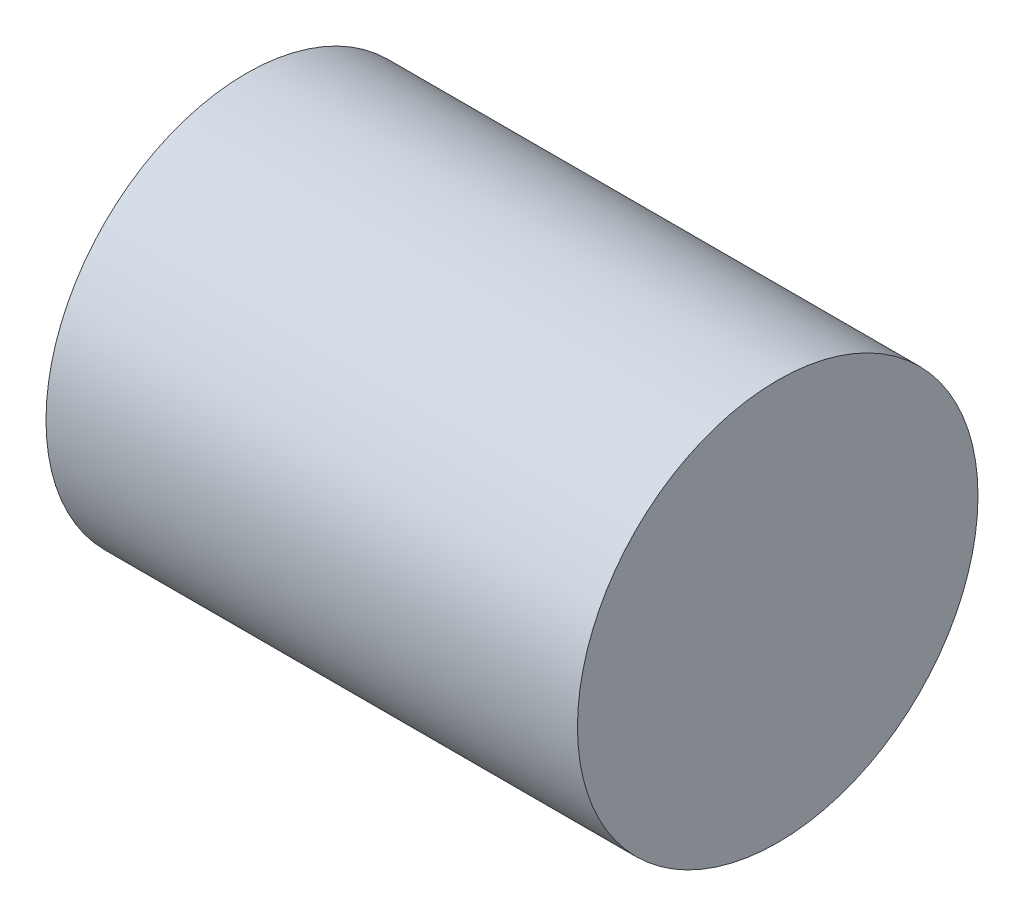
ISO-10303-21;
HEADER;
FILE_DESCRIPTION(('STEP AP214'),'2;1');
FILE_NAME('part.step','',(''),(''),'','','');
FILE_SCHEMA(('AUTOMOTIVE_DESIGN { 1 0 10303 214 1 1 1 1 }'));
ENDSEC;
DATA;
#1=APPLICATION_CONTEXT('core data for automotive mechanical design processes');
#2=APPLICATION_PROTOCOL_DEFINITION('international standard','automotive_design',2000,#1);
#3=PRODUCT_CONTEXT('',#1,'mechanical');
#4=PRODUCT('Part','Part','',(#3));
#5=PRODUCT_RELATED_PRODUCT_CATEGORY('part','',(#4));
#6=PRODUCT_DEFINITION_FORMATION('','',#4);
#7=PRODUCT_DEFINITION_CONTEXT('part definition',#1,'design');
#8=PRODUCT_DEFINITION('design','',#6,#7);
#9=PRODUCT_DEFINITION_SHAPE('','',#8);
#10=(LENGTH_UNIT() NAMED_UNIT(*) SI_UNIT(.MILLI.,.METRE.));
#11=(NAMED_UNIT(*) PLANE_ANGLE_UNIT() SI_UNIT($,.RADIAN.));
#12=(NAMED_UNIT(*) SI_UNIT($,.STERADIAN.) SOLID_ANGLE_UNIT());
#13=UNCERTAINTY_MEASURE_WITH_UNIT(LENGTH_MEASURE(1.E-05),#10,'distance_accuracy_value','');
#14=(GEOMETRIC_REPRESENTATION_CONTEXT(3) GLOBAL_UNCERTAINTY_ASSIGNED_CONTEXT((#13)) GLOBAL_UNIT_ASSIGNED_CONTEXT((#10,
#11,#12)) REPRESENTATION_CONTEXT('',''));
#15=CARTESIAN_POINT('',(0.,0.,0.));
#16=DIRECTION('',(0.,0.,1.));
#17=DIRECTION('',(1.,0.,0.));
#18=AXIS2_PLACEMENT_3D('',#15,#16,#17);
#19=CARTESIAN_POINT('',(-23.137,-2.419,-9.173));
#20=DIRECTION('',(1.,0.,0.));
#21=DIRECTION('',(0.,0.,-1.));
#22=AXIS2_PLACEMENT_3D('',#19,#20,#21);
#23=CYLINDRICAL_SURFACE('',#22,8.719);
#24=CARTESIAN_POINT('',(-23.137,-2.419,-9.173));
#25=DIRECTION('',(1.,0.,0.));
#26=DIRECTION('',(0.,0.,-1.));
#27=AXIS2_PLACEMENT_3D('',#24,#25,#26);
#28=CIRCLE('',#27,8.719);
#29=CARTESIAN_POINT('',(-23.137,-2.419,-17.892));
#30=VERTEX_POINT('',#29);
#31=EDGE_CURVE('E10',#30,#30,#28,.T.);
#32=ORIENTED_EDGE('',*,*,#31,.T.);
#33=EDGE_LOOP('',(#32));
#34=FACE_BOUND('',#33,.T.);
#35=CARTESIAN_POINT('',(0.,-2.419,-9.173));
#36=DIRECTION('',(1.,0.,0.));
#37=DIRECTION('',(0.,0.,-1.));
#38=AXIS2_PLACEMENT_3D('',#35,#36,#37);
#39=CIRCLE('',#38,8.719);
#40=CARTESIAN_POINT('',(0.,-2.419,-17.892));
#41=VERTEX_POINT('',#40);
#42=EDGE_CURVE('E45',#41,#41,#39,.T.);
#43=ORIENTED_EDGE('',*,*,#42,.F.);
#44=EDGE_LOOP('',(#43));
#45=FACE_BOUND('',#44,.T.);
#46=ADVANCED_FACE('F39',(#34,#45),#23,.T.);
#47=CARTESIAN_POINT('',(-23.137,-2.419,-9.173));
#48=DIRECTION('',(1.,0.,0.));
#49=DIRECTION('',(0.,0.,-1.));
#50=AXIS2_PLACEMENT_3D('',#47,#48,#49);
#51=PLANE('',#50);
#52=ORIENTED_EDGE('',*,*,#31,.F.);
#53=EDGE_LOOP('',(#52));
#54=FACE_BOUND('',#53,.T.);
#55=ADVANCED_FACE('F53',(#54),#51,.F.);
#56=CARTESIAN_POINT('',(0.,-2.419,-9.173));
#57=DIRECTION('',(1.,0.,0.));
#58=DIRECTION('',(0.,0.,-1.));
#59=AXIS2_PLACEMENT_3D('',#56,#57,#58);
#60=PLANE('',#59);
#61=ORIENTED_EDGE('',*,*,#42,.T.);
#62=EDGE_LOOP('',(#61));
#63=FACE_BOUND('',#62,.T.);
#64=ADVANCED_FACE('F51',(#63),#60,.T.);
#65=CLOSED_SHELL('',(#46,#55,#64));
#66=MANIFOLD_SOLID_BREP('B2',#65);
#67=ADVANCED_BREP_SHAPE_REPRESENTATION('',(#18,#66),#14);
#68=SHAPE_DEFINITION_REPRESENTATION(#9,#67);
ENDSEC;
END-ISO-10303-21;
